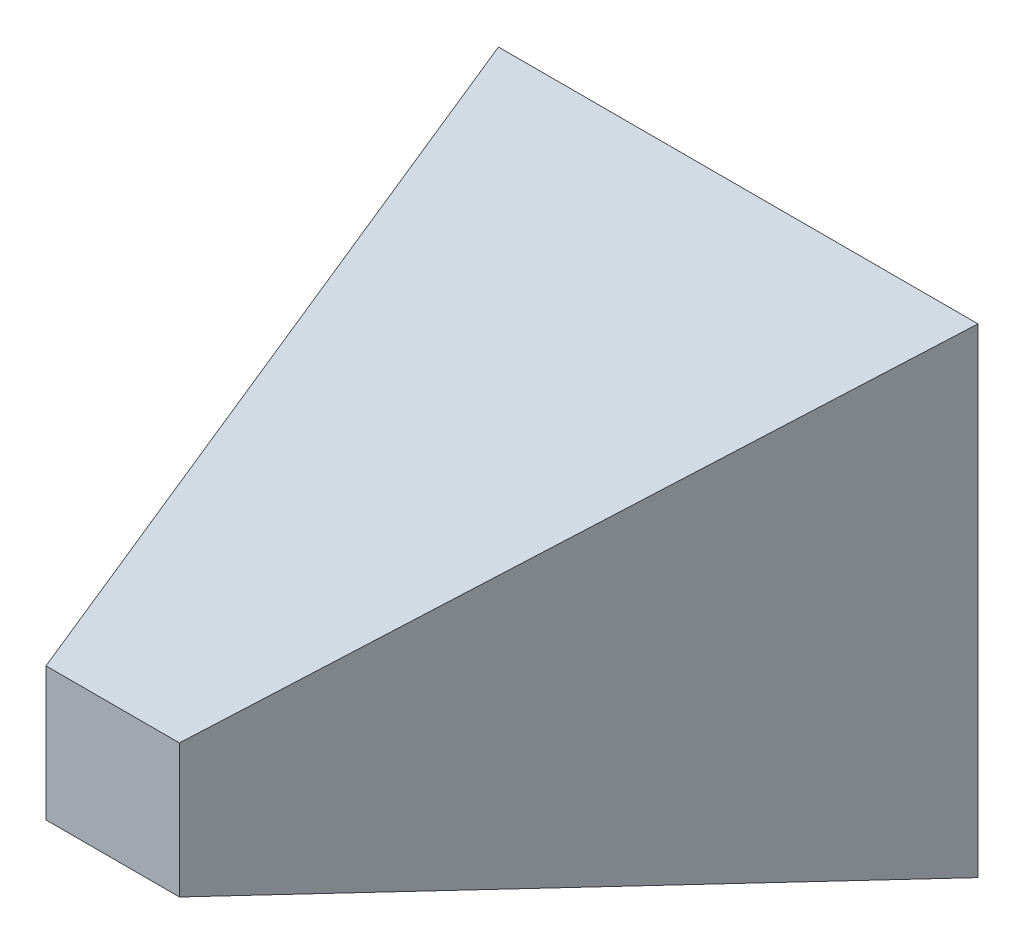
ISO-10303-21;
HEADER;
FILE_DESCRIPTION(('STEP AP214'),'2;1');
FILE_NAME('part.step','',(''),(''),'','','');
FILE_SCHEMA(('AUTOMOTIVE_DESIGN { 1 0 10303 214 1 1 1 1 }'));
ENDSEC;
DATA;
#1=APPLICATION_CONTEXT('core data for automotive mechanical design processes');
#2=APPLICATION_PROTOCOL_DEFINITION('international standard','automotive_design',2000,#1);
#3=PRODUCT_CONTEXT('',#1,'mechanical');
#4=PRODUCT('Part','Part','',(#3));
#5=PRODUCT_RELATED_PRODUCT_CATEGORY('part','',(#4));
#6=PRODUCT_DEFINITION_FORMATION('','',#4);
#7=PRODUCT_DEFINITION_CONTEXT('part definition',#1,'design');
#8=PRODUCT_DEFINITION('design','',#6,#7);
#9=PRODUCT_DEFINITION_SHAPE('','',#8);
#10=(LENGTH_UNIT() NAMED_UNIT(*) SI_UNIT(.MILLI.,.METRE.));
#11=(NAMED_UNIT(*) PLANE_ANGLE_UNIT() SI_UNIT($,.RADIAN.));
#12=(NAMED_UNIT(*) SI_UNIT($,.STERADIAN.) SOLID_ANGLE_UNIT());
#13=UNCERTAINTY_MEASURE_WITH_UNIT(LENGTH_MEASURE(1.E-05),#10,'distance_accuracy_value','');
#14=(GEOMETRIC_REPRESENTATION_CONTEXT(3) GLOBAL_UNCERTAINTY_ASSIGNED_CONTEXT((#13)) GLOBAL_UNIT_ASSIGNED_CONTEXT((#10,
#11,#12)) REPRESENTATION_CONTEXT('',''));
#15=CARTESIAN_POINT('',(0.,0.,0.));
#16=DIRECTION('',(0.,0.,1.));
#17=DIRECTION('',(1.,0.,0.));
#18=AXIS2_PLACEMENT_3D('',#15,#16,#17);
#19=CARTESIAN_POINT('',(0.,0.,0.));
#20=DIRECTION('',(0.,0.,-1.));
#21=DIRECTION('',(-1.,0.,0.));
#22=AXIS2_PLACEMENT_3D('',#19,#20,#21);
#23=PLANE('',#22);
#24=DIRECTION('',(0.,-1.,0.));
#25=VECTOR('',#24,1.);
#26=CARTESIAN_POINT('',(0.,0.,0.));
#27=LINE('',#26,#25);
#28=CARTESIAN_POINT('',(0.,115.,0.));
#29=VERTEX_POINT('',#28);
#30=CARTESIAN_POINT('',(0.,0.,0.));
#31=VERTEX_POINT('',#30);
#32=EDGE_CURVE('E97',#29,#31,#27,.T.);
#33=ORIENTED_EDGE('',*,*,#32,.F.);
#34=DIRECTION('',(-1.,0.,0.));
#35=VECTOR('',#34,1.);
#36=CARTESIAN_POINT('',(0.,115.,0.));
#37=LINE('',#36,#35);
#38=CARTESIAN_POINT('',(115.,115.,0.));
#39=VERTEX_POINT('',#38);
#40=EDGE_CURVE('E240',#39,#29,#37,.T.);
#41=ORIENTED_EDGE('',*,*,#40,.F.);
#42=DIRECTION('',(0.,1.,0.));
#43=VECTOR('',#42,1.);
#44=CARTESIAN_POINT('',(115.,0.,0.));
#45=LINE('',#44,#43);
#46=CARTESIAN_POINT('',(115.,0.,0.));
#47=VERTEX_POINT('',#46);
#48=EDGE_CURVE('E54',#47,#39,#45,.T.);
#49=ORIENTED_EDGE('',*,*,#48,.F.);
#50=DIRECTION('',(1.,0.,0.));
#51=VECTOR('',#50,1.);
#52=CARTESIAN_POINT('',(0.,0.,0.));
#53=LINE('',#52,#51);
#54=EDGE_CURVE('E12',#31,#47,#53,.T.);
#55=ORIENTED_EDGE('',*,*,#54,.F.);
#56=EDGE_LOOP('',(#33,#41,#49,#55));
#57=FACE_BOUND('',#56,.T.);
#58=ADVANCED_FACE('F44',(#57),#23,.T.);
#59=CARTESIAN_POINT('',(0.,0.,150.));
#60=DIRECTION('',(0.,0.,-1.));
#61=DIRECTION('',(-1.,0.,0.));
#62=AXIS2_PLACEMENT_3D('',#59,#60,#61);
#63=PLANE('',#62);
#64=DIRECTION('',(0.,-1.,0.));
#65=VECTOR('',#64,1.);
#66=CARTESIAN_POINT('',(41.5,50.2215739847682,150.));
#67=LINE('',#66,#65);
#68=CARTESIAN_POINT('',(41.5,82.2215739847682,150.));
#69=VERTEX_POINT('',#68);
#70=CARTESIAN_POINT('',(41.5,50.2215739847682,150.));
#71=VERTEX_POINT('',#70);
#72=EDGE_CURVE('E94',#69,#71,#67,.T.);
#73=ORIENTED_EDGE('',*,*,#72,.T.);
#74=DIRECTION('',(1.,0.,0.));
#75=VECTOR('',#74,1.);
#76=CARTESIAN_POINT('',(41.5,50.2215739847682,150.));
#77=LINE('',#76,#75);
#78=CARTESIAN_POINT('',(73.5,50.2215739847682,150.));
#79=VERTEX_POINT('',#78);
#80=EDGE_CURVE('E103',#71,#79,#77,.T.);
#81=ORIENTED_EDGE('',*,*,#80,.T.);
#82=DIRECTION('',(0.,1.,0.));
#83=VECTOR('',#82,1.);
#84=CARTESIAN_POINT('',(73.5,50.2215739847682,150.));
#85=LINE('',#84,#83);
#86=CARTESIAN_POINT('',(73.5,82.2215739847682,150.));
#87=VERTEX_POINT('',#86);
#88=EDGE_CURVE('E108',#79,#87,#85,.T.);
#89=ORIENTED_EDGE('',*,*,#88,.T.);
#90=DIRECTION('',(-1.,0.,0.));
#91=VECTOR('',#90,1.);
#92=CARTESIAN_POINT('',(41.5,82.2215739847682,150.));
#93=LINE('',#92,#91);
#94=EDGE_CURVE('E114',#87,#69,#93,.T.);
#95=ORIENTED_EDGE('',*,*,#94,.T.);
#96=EDGE_LOOP('',(#73,#81,#89,#95));
#97=FACE_BOUND('',#96,.T.);
#98=ADVANCED_FACE('F112',(#97),#63,.F.);
#99=CARTESIAN_POINT('',(0.,0.,0.));
#100=DIRECTION('',(-0.963793555342008,0.,0.266649550311289));
#101=DIRECTION('',(0.266649550311289,0.,0.963793555342008));
#102=AXIS2_PLACEMENT_3D('',#99,#100,#101);
#103=PLANE('',#102);
#104=DIRECTION('',(-0.260925409846885,0.206089740774943,-0.943103891012836));
#105=VECTOR('',#104,1.);
#106=CARTESIAN_POINT('',(41.5,82.2215739847682,150.));
#107=LINE('',#106,#105);
#108=EDGE_CURVE('E101',#69,#29,#107,.T.);
#109=ORIENTED_EDGE('',*,*,#108,.T.);
#110=ORIENTED_EDGE('',*,*,#32,.T.);
#111=DIRECTION('',(-0.253764699499046,-0.307095485075031,-0.917221805418237));
#112=VECTOR('',#111,1.);
#113=CARTESIAN_POINT('',(41.5,50.2215739847682,150.));
#114=LINE('',#113,#112);
#115=EDGE_CURVE('E89',#71,#31,#114,.T.);
#116=ORIENTED_EDGE('',*,*,#115,.F.);
#117=ORIENTED_EDGE('',*,*,#72,.F.);
#118=EDGE_LOOP('',(#109,#110,#116,#117));
#119=FACE_BOUND('',#118,.T.);
#120=ADVANCED_FACE('F92',(#119),#103,.T.);
#121=CARTESIAN_POINT('',(0.,0.,0.));
#122=DIRECTION('',(0.,-0.948262239946503,0.317488148269569));
#123=DIRECTION('',(0.,-0.317488148269569,-0.948262239946503));
#124=AXIS2_PLACEMENT_3D('',#121,#122,#123);
#125=PLANE('',#124);
#126=ORIENTED_EDGE('',*,*,#115,.T.);
#127=ORIENTED_EDGE('',*,*,#54,.T.);
#128=DIRECTION('',(0.253764699499046,-0.307095485075031,-0.917221805418237));
#129=VECTOR('',#128,1.);
#130=CARTESIAN_POINT('',(73.5,50.2215739847682,150.));
#131=LINE('',#130,#129);
#132=EDGE_CURVE('E62',#79,#47,#131,.T.);
#133=ORIENTED_EDGE('',*,*,#132,.F.);
#134=ORIENTED_EDGE('',*,*,#80,.F.);
#135=EDGE_LOOP('',(#126,#127,#133,#134));
#136=FACE_BOUND('',#135,.T.);
#137=ADVANCED_FACE('F105',(#136),#125,.T.);
#138=CARTESIAN_POINT('',(0.,109.758773617053,23.9847989368609));
#139=DIRECTION('',(0.,0.97694632319752,0.213485085171884));
#140=DIRECTION('',(0.,-0.213485085171884,0.97694632319752));
#141=AXIS2_PLACEMENT_3D('',#138,#139,#140);
#142=PLANE('',#141);
#143=DIRECTION('',(0.260925409846885,0.206089740774943,-0.943103891012836));
#144=VECTOR('',#143,1.);
#145=CARTESIAN_POINT('',(73.5,82.2215739847682,150.));
#146=LINE('',#145,#144);
#147=EDGE_CURVE('E100',#87,#39,#146,.T.);
#148=ORIENTED_EDGE('',*,*,#147,.T.);
#149=ORIENTED_EDGE('',*,*,#40,.T.);
#150=ORIENTED_EDGE('',*,*,#108,.F.);
#151=ORIENTED_EDGE('',*,*,#94,.F.);
#152=EDGE_LOOP('',(#148,#149,#150,#151));
#153=FACE_BOUND('',#152,.T.);
#154=ADVANCED_FACE('F176',(#153),#142,.T.);
#155=CARTESIAN_POINT('',(106.823271991661,0.,29.5544385843594));
#156=DIRECTION('',(0.963793555342008,0.,0.266649550311289));
#157=DIRECTION('',(0.266649550311289,0.,-0.963793555342008));
#158=AXIS2_PLACEMENT_3D('',#155,#156,#157);
#159=PLANE('',#158);
#160=ORIENTED_EDGE('',*,*,#132,.T.);
#161=ORIENTED_EDGE('',*,*,#48,.T.);
#162=ORIENTED_EDGE('',*,*,#147,.F.);
#163=ORIENTED_EDGE('',*,*,#88,.F.);
#164=EDGE_LOOP('',(#160,#161,#162,#163));
#165=FACE_BOUND('',#164,.T.);
#166=ADVANCED_FACE('F167',(#165),#159,.T.);
#167=CLOSED_SHELL('',(#58,#98,#120,#137,#154,#166));
#168=MANIFOLD_SOLID_BREP('B2',#167);
#169=ADVANCED_BREP_SHAPE_REPRESENTATION('',(#18,#168),#14);
#170=SHAPE_DEFINITION_REPRESENTATION(#9,#169);
ENDSEC;
END-ISO-10303-21;
